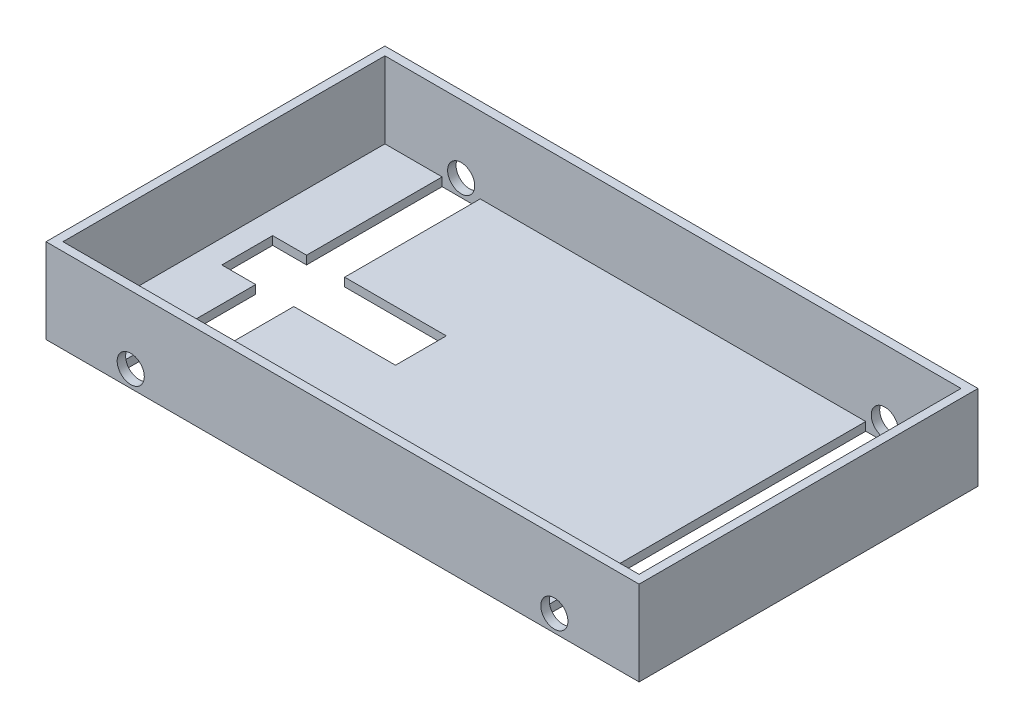
ISO-10303-21;
HEADER;
FILE_DESCRIPTION(('STEP AP214'),'2;1');
FILE_NAME('part.step','',(''),(''),'','','');
FILE_SCHEMA(('AUTOMOTIVE_DESIGN { 1 0 10303 214 1 1 1 1 }'));
ENDSEC;
DATA;
#1=APPLICATION_CONTEXT('core data for automotive mechanical design processes');
#2=APPLICATION_PROTOCOL_DEFINITION('international standard','automotive_design',2000,#1);
#3=PRODUCT_CONTEXT('',#1,'mechanical');
#4=PRODUCT('Part','Part','',(#3));
#5=PRODUCT_RELATED_PRODUCT_CATEGORY('part','',(#4));
#6=PRODUCT_DEFINITION_FORMATION('','',#4);
#7=PRODUCT_DEFINITION_CONTEXT('part definition',#1,'design');
#8=PRODUCT_DEFINITION('design','',#6,#7);
#9=PRODUCT_DEFINITION_SHAPE('','',#8);
#10=(LENGTH_UNIT() NAMED_UNIT(*) SI_UNIT(.MILLI.,.METRE.));
#11=(NAMED_UNIT(*) PLANE_ANGLE_UNIT() SI_UNIT($,.RADIAN.));
#12=(NAMED_UNIT(*) SI_UNIT($,.STERADIAN.) SOLID_ANGLE_UNIT());
#13=UNCERTAINTY_MEASURE_WITH_UNIT(LENGTH_MEASURE(1.E-05),#10,'distance_accuracy_value','');
#14=(GEOMETRIC_REPRESENTATION_CONTEXT(3) GLOBAL_UNCERTAINTY_ASSIGNED_CONTEXT((#13)) GLOBAL_UNIT_ASSIGNED_CONTEXT((#10,
#11,#12)) REPRESENTATION_CONTEXT('',''));
#15=CARTESIAN_POINT('',(0.,0.,0.));
#16=DIRECTION('',(0.,0.,1.));
#17=DIRECTION('',(1.,0.,0.));
#18=AXIS2_PLACEMENT_3D('',#15,#16,#17);
#19=CARTESIAN_POINT('',(-136.244997998398,-5.,0.));
#20=DIRECTION('',(-1.,0.,0.));
#21=DIRECTION('',(0.,0.,1.));
#22=AXIS2_PLACEMENT_3D('',#19,#20,#21);
#23=PLANE('',#22);
#24=DIRECTION('',(0.,0.,1.));
#25=VECTOR('',#24,1.);
#26=CARTESIAN_POINT('',(-136.244997998398,5.,0.));
#27=LINE('',#26,#25);
#28=CARTESIAN_POINT('',(-136.244997998398,5.,-95.));
#29=VERTEX_POINT('',#28);
#30=CARTESIAN_POINT('',(-136.244997998398,5.,-15.));
#31=VERTEX_POINT('',#30);
#32=EDGE_CURVE('E265',#29,#31,#27,.T.);
#33=ORIENTED_EDGE('',*,*,#32,.T.);
#34=DIRECTION('',(0.,-1.,0.));
#35=VECTOR('',#34,1.);
#36=CARTESIAN_POINT('',(-136.244997998398,-5.,-15.));
#37=LINE('',#36,#35);
#38=CARTESIAN_POINT('',(-136.244997998398,0.,-15.));
#39=VERTEX_POINT('',#38);
#40=EDGE_CURVE('E260',#31,#39,#37,.T.);
#41=ORIENTED_EDGE('',*,*,#40,.T.);
#42=DIRECTION('',(0.,0.,1.));
#43=VECTOR('',#42,1.);
#44=CARTESIAN_POINT('',(-136.244997998398,0.,0.));
#45=LINE('',#44,#43);
#46=CARTESIAN_POINT('',(-136.244997998398,0.,-95.));
#47=VERTEX_POINT('',#46);
#48=EDGE_CURVE('E461',#47,#39,#45,.T.);
#49=ORIENTED_EDGE('',*,*,#48,.F.);
#50=DIRECTION('',(0.,1.,0.));
#51=VECTOR('',#50,1.);
#52=CARTESIAN_POINT('',(-136.244997998398,-5.,-95.));
#53=LINE('',#52,#51);
#54=EDGE_CURVE('E275',#47,#29,#53,.T.);
#55=ORIENTED_EDGE('',*,*,#54,.T.);
#56=EDGE_LOOP('',(#33,#41,#49,#55));
#57=FACE_BOUND('',#56,.T.);
#58=ADVANCED_FACE('F46',(#57),#23,.F.);
#59=CARTESIAN_POINT('',(-113.755002001602,-5.,0.));
#60=DIRECTION('',(-1.,0.,0.));
#61=DIRECTION('',(0.,0.,1.));
#62=AXIS2_PLACEMENT_3D('',#59,#60,#61);
#63=PLANE('',#62);
#64=DIRECTION('',(0.,-1.,0.));
#65=VECTOR('',#64,1.);
#66=CARTESIAN_POINT('',(-113.755002001602,-5.,-15.));
#67=LINE('',#66,#65);
#68=CARTESIAN_POINT('',(-113.755002001602,5.,-15.));
#69=VERTEX_POINT('',#68);
#70=CARTESIAN_POINT('',(-113.755002001602,0.,-15.));
#71=VERTEX_POINT('',#70);
#72=EDGE_CURVE('E468',#69,#71,#67,.T.);
#73=ORIENTED_EDGE('',*,*,#72,.F.);
#74=DIRECTION('',(0.,0.,1.));
#75=VECTOR('',#74,1.);
#76=CARTESIAN_POINT('',(-113.755002001602,5.,0.));
#77=LINE('',#76,#75);
#78=CARTESIAN_POINT('',(-113.755002001602,5.,-95.));
#79=VERTEX_POINT('',#78);
#80=EDGE_CURVE('E270',#79,#69,#77,.T.);
#81=ORIENTED_EDGE('',*,*,#80,.F.);
#82=DIRECTION('',(0.,1.,0.));
#83=VECTOR('',#82,1.);
#84=CARTESIAN_POINT('',(-113.755002001602,-5.,-95.));
#85=LINE('',#84,#83);
#86=CARTESIAN_POINT('',(-113.755002001602,0.,-95.));
#87=VERTEX_POINT('',#86);
#88=EDGE_CURVE('E279',#87,#79,#85,.T.);
#89=ORIENTED_EDGE('',*,*,#88,.F.);
#90=DIRECTION('',(0.,0.,1.));
#91=VECTOR('',#90,1.);
#92=CARTESIAN_POINT('',(-113.755002001602,0.,0.));
#93=LINE('',#92,#91);
#94=EDGE_CURVE('E456',#87,#71,#93,.T.);
#95=ORIENTED_EDGE('',*,*,#94,.T.);
#96=EDGE_LOOP('',(#73,#81,#89,#95));
#97=FACE_BOUND('',#96,.T.);
#98=ADVANCED_FACE('F493',(#97),#63,.T.);
#99=CARTESIAN_POINT('',(0.,5.,0.));
#100=DIRECTION('',(0.,1.,0.));
#101=DIRECTION('',(0.,0.,1.));
#102=AXIS2_PLACEMENT_3D('',#99,#100,#101);
#103=PLANE('',#102);
#104=DIRECTION('',(-1.,0.,0.));
#105=VECTOR('',#104,1.);
#106=CARTESIAN_POINT('',(-156.244997998398,5.,-15.));
#107=LINE('',#106,#105);
#108=CARTESIAN_POINT('',(-53.7550020016016,5.,-15.));
#109=VERTEX_POINT('',#108);
#110=EDGE_CURVE('E215',#109,#69,#107,.T.);
#111=ORIENTED_EDGE('',*,*,#110,.F.);
#112=DIRECTION('',(0.,0.,-1.));
#113=VECTOR('',#112,1.);
#114=CARTESIAN_POINT('',(-53.7550020016016,5.,-15.));
#115=LINE('',#114,#113);
#116=CARTESIAN_POINT('',(-53.7550020016016,5.,15.));
#117=VERTEX_POINT('',#116);
#118=EDGE_CURVE('E233',#117,#109,#115,.T.);
#119=ORIENTED_EDGE('',*,*,#118,.F.);
#120=DIRECTION('',(1.,0.,0.));
#121=VECTOR('',#120,1.);
#122=CARTESIAN_POINT('',(-156.244997998398,5.,15.));
#123=LINE('',#122,#121);
#124=CARTESIAN_POINT('',(-113.755002001602,5.,15.));
#125=VERTEX_POINT('',#124);
#126=EDGE_CURVE('E226',#125,#117,#123,.T.);
#127=ORIENTED_EDGE('',*,*,#126,.F.);
#128=CARTESIAN_POINT('',(-113.755002001602,5.,95.));
#129=VERTEX_POINT('',#128);
#130=EDGE_CURVE('E269',#125,#129,#77,.T.);
#131=ORIENTED_EDGE('',*,*,#130,.T.);
#132=DIRECTION('',(-1.,0.,0.));
#133=VECTOR('',#132,1.);
#134=CARTESIAN_POINT('',(175.,5.,95.));
#135=LINE('',#134,#133);
#136=CARTESIAN_POINT('',(113.755002001602,5.,95.));
#137=VERTEX_POINT('',#136);
#138=EDGE_CURVE('E395',#137,#129,#135,.T.);
#139=ORIENTED_EDGE('',*,*,#138,.F.);
#140=DIRECTION('',(0.,0.,1.));
#141=VECTOR('',#140,1.);
#142=CARTESIAN_POINT('',(113.755002001602,5.,0.));
#143=LINE('',#142,#141);
#144=CARTESIAN_POINT('',(113.755002001602,5.,-95.));
#145=VERTEX_POINT('',#144);
#146=EDGE_CURVE('E289',#145,#137,#143,.T.);
#147=ORIENTED_EDGE('',*,*,#146,.F.);
#148=DIRECTION('',(-1.,0.,0.));
#149=VECTOR('',#148,1.);
#150=CARTESIAN_POINT('',(175.,5.,-95.));
#151=LINE('',#150,#149);
#152=EDGE_CURVE('E379',#145,#79,#151,.T.);
#153=ORIENTED_EDGE('',*,*,#152,.T.);
#154=ORIENTED_EDGE('',*,*,#80,.T.);
#155=EDGE_LOOP('',(#111,#119,#127,#131,#139,#147,#153,#154));
#156=FACE_BOUND('',#155,.T.);
#157=ADVANCED_FACE('F486',(#156),#103,.T.);
#158=CARTESIAN_POINT('',(170.,5.,-95.));
#159=VERTEX_POINT('',#158);
#160=CARTESIAN_POINT('',(136.244997998398,5.,-95.));
#161=VERTEX_POINT('',#160);
#162=EDGE_CURVE('E374',#159,#161,#151,.T.);
#163=ORIENTED_EDGE('',*,*,#162,.T.);
#164=DIRECTION('',(0.,0.,1.));
#165=VECTOR('',#164,1.);
#166=CARTESIAN_POINT('',(136.244997998398,5.,0.));
#167=LINE('',#166,#165);
#168=CARTESIAN_POINT('',(136.244997998398,5.,95.));
#169=VERTEX_POINT('',#168);
#170=EDGE_CURVE('E293',#161,#169,#167,.T.);
#171=ORIENTED_EDGE('',*,*,#170,.T.);
#172=CARTESIAN_POINT('',(170.,5.,95.));
#173=VERTEX_POINT('',#172);
#174=EDGE_CURVE('E390',#173,#169,#135,.T.);
#175=ORIENTED_EDGE('',*,*,#174,.F.);
#176=DIRECTION('',(0.,0.,-1.));
#177=VECTOR('',#176,1.);
#178=CARTESIAN_POINT('',(170.,5.,100.));
#179=LINE('',#178,#177);
#180=EDGE_CURVE('E358',#173,#159,#179,.T.);
#181=ORIENTED_EDGE('',*,*,#180,.T.);
#182=EDGE_LOOP('',(#163,#171,#175,#181));
#183=FACE_BOUND('',#182,.T.);
#184=ADVANCED_FACE('F553',(#183),#103,.T.);
#185=CARTESIAN_POINT('',(125.,10.,-122.62741699797));
#186=DIRECTION('',(0.,0.,1.));
#187=DIRECTION('',(1.,0.,0.));
#188=AXIS2_PLACEMENT_3D('',#185,#186,#187);
#189=CYLINDRICAL_SURFACE('',#188,8.);
#190=CARTESIAN_POINT('',(125.,10.,-100.));
#191=DIRECTION('',(0.,0.,1.));
#192=DIRECTION('',(1.,0.,0.));
#193=AXIS2_PLACEMENT_3D('',#190,#191,#192);
#194=CIRCLE('',#193,8.);
#195=CARTESIAN_POINT('',(133.,10.,-100.));
#196=VERTEX_POINT('',#195);
#197=EDGE_CURVE('E326',#196,#196,#194,.F.);
#198=ORIENTED_EDGE('',*,*,#197,.T.);
#199=EDGE_LOOP('',(#198));
#200=FACE_BOUND('',#199,.T.);
#201=CARTESIAN_POINT('',(125.,10.,-95.));
#202=DIRECTION('',(0.,0.,1.));
#203=DIRECTION('',(1.,0.,0.));
#204=AXIS2_PLACEMENT_3D('',#201,#202,#203);
#205=CIRCLE('',#204,8.);
#206=CARTESIAN_POINT('',(133.,10.,-95.));
#207=VERTEX_POINT('',#206);
#208=EDGE_CURVE('E346',#207,#207,#205,.T.);
#209=ORIENTED_EDGE('',*,*,#208,.T.);
#210=EDGE_LOOP('',(#209));
#211=FACE_BOUND('',#210,.T.);
#212=ADVANCED_FACE('F581',(#200,#211),#189,.F.);
#213=CARTESIAN_POINT('',(-125.,10.,-122.62741699797));
#214=DIRECTION('',(0.,0.,1.));
#215=DIRECTION('',(1.,0.,0.));
#216=AXIS2_PLACEMENT_3D('',#213,#214,#215);
#217=CYLINDRICAL_SURFACE('',#216,8.00000000000001);
#218=CARTESIAN_POINT('',(-125.,10.,-100.));
#219=DIRECTION('',(0.,0.,1.));
#220=DIRECTION('',(1.,0.,0.));
#221=AXIS2_PLACEMENT_3D('',#218,#219,#220);
#222=CIRCLE('',#221,8.00000000000001);
#223=CARTESIAN_POINT('',(-117.,10.,-100.));
#224=VERTEX_POINT('',#223);
#225=EDGE_CURVE('E331',#224,#224,#222,.F.);
#226=ORIENTED_EDGE('',*,*,#225,.T.);
#227=EDGE_LOOP('',(#226));
#228=FACE_BOUND('',#227,.T.);
#229=CARTESIAN_POINT('',(-125.,10.,-95.));
#230=DIRECTION('',(0.,0.,1.));
#231=DIRECTION('',(1.,0.,0.));
#232=AXIS2_PLACEMENT_3D('',#229,#230,#231);
#233=CIRCLE('',#232,8.00000000000001);
#234=CARTESIAN_POINT('',(-117.,10.,-95.));
#235=VERTEX_POINT('',#234);
#236=EDGE_CURVE('E354',#235,#235,#233,.T.);
#237=ORIENTED_EDGE('',*,*,#236,.T.);
#238=EDGE_LOOP('',(#237));
#239=FACE_BOUND('',#238,.T.);
#240=ADVANCED_FACE('F543',(#228,#239),#217,.F.);
#241=CARTESIAN_POINT('',(-156.244997998398,5.,-15.));
#242=VERTEX_POINT('',#241);
#243=EDGE_CURVE('E238',#31,#242,#107,.T.);
#244=ORIENTED_EDGE('',*,*,#243,.F.);
#245=ORIENTED_EDGE('',*,*,#32,.F.);
#246=CARTESIAN_POINT('',(-170.,5.,-95.));
#247=VERTEX_POINT('',#246);
#248=EDGE_CURVE('E362',#29,#247,#151,.T.);
#249=ORIENTED_EDGE('',*,*,#248,.T.);
#250=DIRECTION('',(0.,0.,-1.));
#251=VECTOR('',#250,1.);
#252=CARTESIAN_POINT('',(-170.,5.,100.));
#253=LINE('',#252,#251);
#254=CARTESIAN_POINT('',(-170.,5.,95.));
#255=VERTEX_POINT('',#254);
#256=EDGE_CURVE('E378',#255,#247,#253,.T.);
#257=ORIENTED_EDGE('',*,*,#256,.F.);
#258=CARTESIAN_POINT('',(-136.244997998398,5.,95.));
#259=VERTEX_POINT('',#258);
#260=EDGE_CURVE('E386',#259,#255,#135,.T.);
#261=ORIENTED_EDGE('',*,*,#260,.F.);
#262=CARTESIAN_POINT('',(-136.244997998398,5.,15.));
#263=VERTEX_POINT('',#262);
#264=EDGE_CURVE('E231',#263,#259,#27,.T.);
#265=ORIENTED_EDGE('',*,*,#264,.F.);
#266=CARTESIAN_POINT('',(-156.244997998398,5.,15.));
#267=VERTEX_POINT('',#266);
#268=EDGE_CURVE('E62',#267,#263,#123,.T.);
#269=ORIENTED_EDGE('',*,*,#268,.F.);
#270=DIRECTION('',(0.,0.,1.));
#271=VECTOR('',#270,1.);
#272=CARTESIAN_POINT('',(-156.244997998398,5.,-15.));
#273=LINE('',#272,#271);
#274=EDGE_CURVE('E218',#242,#267,#273,.T.);
#275=ORIENTED_EDGE('',*,*,#274,.F.);
#276=EDGE_LOOP('',(#244,#245,#249,#257,#261,#265,#269,#275));
#277=FACE_BOUND('',#276,.T.);
#278=ADVANCED_FACE('F229',(#277),#103,.T.);
#279=CARTESIAN_POINT('',(175.,50.,100.));
#280=DIRECTION('',(-1.,0.,0.));
#281=DIRECTION('',(0.,0.,1.));
#282=AXIS2_PLACEMENT_3D('',#279,#280,#281);
#283=PLANE('',#282);
#284=DIRECTION('',(0.,0.,-1.));
#285=VECTOR('',#284,1.);
#286=CARTESIAN_POINT('',(175.,0.,100.));
#287=LINE('',#286,#285);
#288=CARTESIAN_POINT('',(175.,0.,100.));
#289=VERTEX_POINT('',#288);
#290=CARTESIAN_POINT('',(175.,0.,-100.));
#291=VERTEX_POINT('',#290);
#292=EDGE_CURVE('E367',#289,#291,#287,.T.);
#293=ORIENTED_EDGE('',*,*,#292,.T.);
#294=DIRECTION('',(0.,-1.,0.));
#295=VECTOR('',#294,1.);
#296=CARTESIAN_POINT('',(175.,50.,-100.));
#297=LINE('',#296,#295);
#298=CARTESIAN_POINT('',(175.,50.,-100.));
#299=VERTEX_POINT('',#298);
#300=EDGE_CURVE('E447',#299,#291,#297,.T.);
#301=ORIENTED_EDGE('',*,*,#300,.F.);
#302=DIRECTION('',(0.,0.,-1.));
#303=VECTOR('',#302,1.);
#304=CARTESIAN_POINT('',(175.,50.,100.));
#305=LINE('',#304,#303);
#306=CARTESIAN_POINT('',(175.,50.,100.));
#307=VERTEX_POINT('',#306);
#308=EDGE_CURVE('E408',#307,#299,#305,.T.);
#309=ORIENTED_EDGE('',*,*,#308,.F.);
#310=DIRECTION('',(0.,-1.,0.));
#311=VECTOR('',#310,1.);
#312=CARTESIAN_POINT('',(175.,50.,100.));
#313=LINE('',#312,#311);
#314=EDGE_CURVE('E424',#307,#289,#313,.T.);
#315=ORIENTED_EDGE('',*,*,#314,.T.);
#316=EDGE_LOOP('',(#293,#301,#309,#315));
#317=FACE_BOUND('',#316,.T.);
#318=ADVANCED_FACE('F48',(#317),#283,.F.);
#319=CARTESIAN_POINT('',(175.,50.,-100.));
#320=DIRECTION('',(0.,0.,1.));
#321=DIRECTION('',(1.,0.,0.));
#322=AXIS2_PLACEMENT_3D('',#319,#320,#321);
#323=PLANE('',#322);
#324=ORIENTED_EDGE('',*,*,#225,.F.);
#325=EDGE_LOOP('',(#324));
#326=FACE_BOUND('',#325,.T.);
#327=ORIENTED_EDGE('',*,*,#197,.F.);
#328=EDGE_LOOP('',(#327));
#329=FACE_BOUND('',#328,.T.);
#330=DIRECTION('',(-1.,0.,0.));
#331=VECTOR('',#330,1.);
#332=CARTESIAN_POINT('',(175.,0.,-100.));
#333=LINE('',#332,#331);
#334=CARTESIAN_POINT('',(-175.,0.,-100.));
#335=VERTEX_POINT('',#334);
#336=EDGE_CURVE('E428',#291,#335,#333,.T.);
#337=ORIENTED_EDGE('',*,*,#336,.T.);
#338=DIRECTION('',(0.,-1.,0.));
#339=VECTOR('',#338,1.);
#340=CARTESIAN_POINT('',(-175.,50.,-100.));
#341=LINE('',#340,#339);
#342=CARTESIAN_POINT('',(-175.,50.,-100.));
#343=VERTEX_POINT('',#342);
#344=EDGE_CURVE('E444',#343,#335,#341,.T.);
#345=ORIENTED_EDGE('',*,*,#344,.F.);
#346=DIRECTION('',(-1.,0.,0.));
#347=VECTOR('',#346,1.);
#348=CARTESIAN_POINT('',(175.,50.,-100.));
#349=LINE('',#348,#347);
#350=EDGE_CURVE('E412',#299,#343,#349,.T.);
#351=ORIENTED_EDGE('',*,*,#350,.F.);
#352=ORIENTED_EDGE('',*,*,#300,.T.);
#353=EDGE_LOOP('',(#337,#345,#351,#352));
#354=FACE_BOUND('',#353,.T.);
#355=ADVANCED_FACE('F605',(#326,#329,#354),#323,.F.);
#356=CARTESIAN_POINT('',(-175.,50.,100.));
#357=DIRECTION('',(-1.,0.,0.));
#358=DIRECTION('',(0.,0.,1.));
#359=AXIS2_PLACEMENT_3D('',#356,#357,#358);
#360=PLANE('',#359);
#361=DIRECTION('',(0.,0.,-1.));
#362=VECTOR('',#361,1.);
#363=CARTESIAN_POINT('',(-175.,0.,100.));
#364=LINE('',#363,#362);
#365=CARTESIAN_POINT('',(-175.,0.,100.));
#366=VERTEX_POINT('',#365);
#367=EDGE_CURVE('E432',#366,#335,#364,.T.);
#368=ORIENTED_EDGE('',*,*,#367,.F.);
#369=DIRECTION('',(0.,-1.,0.));
#370=VECTOR('',#369,1.);
#371=CARTESIAN_POINT('',(-175.,50.,100.));
#372=LINE('',#371,#370);
#373=CARTESIAN_POINT('',(-175.,50.,100.));
#374=VERTEX_POINT('',#373);
#375=EDGE_CURVE('E441',#374,#366,#372,.T.);
#376=ORIENTED_EDGE('',*,*,#375,.F.);
#377=DIRECTION('',(0.,0.,-1.));
#378=VECTOR('',#377,1.);
#379=CARTESIAN_POINT('',(-175.,50.,100.));
#380=LINE('',#379,#378);
#381=EDGE_CURVE('E416',#374,#343,#380,.T.);
#382=ORIENTED_EDGE('',*,*,#381,.T.);
#383=ORIENTED_EDGE('',*,*,#344,.T.);
#384=EDGE_LOOP('',(#368,#376,#382,#383));
#385=FACE_BOUND('',#384,.T.);
#386=ADVANCED_FACE('F602',(#385),#360,.T.);
#387=CARTESIAN_POINT('',(175.,50.,100.));
#388=DIRECTION('',(0.,0.,1.));
#389=DIRECTION('',(1.,0.,0.));
#390=AXIS2_PLACEMENT_3D('',#387,#388,#389);
#391=PLANE('',#390);
#392=CARTESIAN_POINT('',(-125.,10.,100.));
#393=DIRECTION('',(0.,0.,1.));
#394=DIRECTION('',(1.,0.,0.));
#395=AXIS2_PLACEMENT_3D('',#392,#393,#394);
#396=CIRCLE('',#395,8.00000000000001);
#397=CARTESIAN_POINT('',(-117.,10.,100.));
#398=VERTEX_POINT('',#397);
#399=EDGE_CURVE('E327',#398,#398,#396,.T.);
#400=ORIENTED_EDGE('',*,*,#399,.F.);
#401=EDGE_LOOP('',(#400));
#402=FACE_BOUND('',#401,.T.);
#403=CARTESIAN_POINT('',(125.,10.,100.));
#404=DIRECTION('',(0.,0.,1.));
#405=DIRECTION('',(-1.,0.,0.));
#406=AXIS2_PLACEMENT_3D('',#403,#404,#405);
#407=CIRCLE('',#406,8.);
#408=CARTESIAN_POINT('',(117.,10.,100.));
#409=VERTEX_POINT('',#408);
#410=EDGE_CURVE('E332',#409,#409,#407,.T.);
#411=ORIENTED_EDGE('',*,*,#410,.F.);
#412=EDGE_LOOP('',(#411));
#413=FACE_BOUND('',#412,.T.);
#414=DIRECTION('',(-1.,0.,0.));
#415=VECTOR('',#414,1.);
#416=CARTESIAN_POINT('',(175.,0.,100.));
#417=LINE('',#416,#415);
#418=EDGE_CURVE('E413',#289,#366,#417,.T.);
#419=ORIENTED_EDGE('',*,*,#418,.F.);
#420=ORIENTED_EDGE('',*,*,#314,.F.);
#421=DIRECTION('',(-1.,0.,0.));
#422=VECTOR('',#421,1.);
#423=CARTESIAN_POINT('',(175.,50.,100.));
#424=LINE('',#423,#422);
#425=EDGE_CURVE('E420',#307,#374,#424,.T.);
#426=ORIENTED_EDGE('',*,*,#425,.T.);
#427=ORIENTED_EDGE('',*,*,#375,.T.);
#428=EDGE_LOOP('',(#419,#420,#426,#427));
#429=FACE_BOUND('',#428,.T.);
#430=ADVANCED_FACE('F597',(#402,#413,#429),#391,.T.);
#431=CARTESIAN_POINT('',(0.,50.,0.));
#432=DIRECTION('',(0.,1.,0.));
#433=DIRECTION('',(0.,0.,1.));
#434=AXIS2_PLACEMENT_3D('',#431,#432,#433);
#435=PLANE('',#434);
#436=DIRECTION('',(0.,0.,-1.));
#437=VECTOR('',#436,1.);
#438=CARTESIAN_POINT('',(170.,50.,100.));
#439=LINE('',#438,#437);
#440=CARTESIAN_POINT('',(170.,50.,95.));
#441=VERTEX_POINT('',#440);
#442=CARTESIAN_POINT('',(170.,50.,-95.));
#443=VERTEX_POINT('',#442);
#444=EDGE_CURVE('E394',#441,#443,#439,.T.);
#445=ORIENTED_EDGE('',*,*,#444,.F.);
#446=DIRECTION('',(-1.,0.,0.));
#447=VECTOR('',#446,1.);
#448=CARTESIAN_POINT('',(175.,50.,95.));
#449=LINE('',#448,#447);
#450=CARTESIAN_POINT('',(-170.,50.,95.));
#451=VERTEX_POINT('',#450);
#452=EDGE_CURVE('E373',#441,#451,#449,.T.);
#453=ORIENTED_EDGE('',*,*,#452,.T.);
#454=DIRECTION('',(0.,0.,-1.));
#455=VECTOR('',#454,1.);
#456=CARTESIAN_POINT('',(-170.,50.,100.));
#457=LINE('',#456,#455);
#458=CARTESIAN_POINT('',(-170.,50.,-95.));
#459=VERTEX_POINT('',#458);
#460=EDGE_CURVE('E401',#451,#459,#457,.T.);
#461=ORIENTED_EDGE('',*,*,#460,.T.);
#462=DIRECTION('',(-1.,0.,0.));
#463=VECTOR('',#462,1.);
#464=CARTESIAN_POINT('',(175.,50.,-95.));
#465=LINE('',#464,#463);
#466=EDGE_CURVE('E398',#443,#459,#465,.T.);
#467=ORIENTED_EDGE('',*,*,#466,.F.);
#468=EDGE_LOOP('',(#445,#453,#461,#467));
#469=FACE_BOUND('',#468,.T.);
#470=ORIENTED_EDGE('',*,*,#308,.T.);
#471=ORIENTED_EDGE('',*,*,#350,.T.);
#472=ORIENTED_EDGE('',*,*,#381,.F.);
#473=ORIENTED_EDGE('',*,*,#425,.F.);
#474=EDGE_LOOP('',(#470,#471,#472,#473));
#475=FACE_BOUND('',#474,.T.);
#476=ADVANCED_FACE('F594',(#469,#475),#435,.T.);
#477=CARTESIAN_POINT('',(0.,0.,0.));
#478=DIRECTION('',(0.,1.,0.));
#479=DIRECTION('',(0.,0.,1.));
#480=AXIS2_PLACEMENT_3D('',#477,#478,#479);
#481=PLANE('',#480);
#482=ORIENTED_EDGE('',*,*,#48,.T.);
#483=DIRECTION('',(-1.,0.,0.));
#484=VECTOR('',#483,1.);
#485=CARTESIAN_POINT('',(0.,0.,-15.));
#486=LINE('',#485,#484);
#487=CARTESIAN_POINT('',(-156.244997998398,0.,-15.));
#488=VERTEX_POINT('',#487);
#489=EDGE_CURVE('E261',#39,#488,#486,.T.);
#490=ORIENTED_EDGE('',*,*,#489,.T.);
#491=DIRECTION('',(0.,0.,1.));
#492=VECTOR('',#491,1.);
#493=CARTESIAN_POINT('',(-156.244997998398,0.,0.));
#494=LINE('',#493,#492);
#495=CARTESIAN_POINT('',(-156.244997998398,0.,15.));
#496=VERTEX_POINT('',#495);
#497=EDGE_CURVE('E12',#488,#496,#494,.T.);
#498=ORIENTED_EDGE('',*,*,#497,.T.);
#499=DIRECTION('',(1.,0.,0.));
#500=VECTOR('',#499,1.);
#501=CARTESIAN_POINT('',(0.,0.,15.));
#502=LINE('',#501,#500);
#503=CARTESIAN_POINT('',(-136.244997998398,0.,15.));
#504=VERTEX_POINT('',#503);
#505=EDGE_CURVE('E211',#496,#504,#502,.T.);
#506=ORIENTED_EDGE('',*,*,#505,.T.);
#507=CARTESIAN_POINT('',(-136.244997998398,0.,95.));
#508=VERTEX_POINT('',#507);
#509=EDGE_CURVE('E460',#504,#508,#45,.T.);
#510=ORIENTED_EDGE('',*,*,#509,.T.);
#511=DIRECTION('',(1.,0.,0.));
#512=VECTOR('',#511,1.);
#513=CARTESIAN_POINT('',(0.,0.,95.));
#514=LINE('',#513,#512);
#515=CARTESIAN_POINT('',(-113.755002001602,0.,95.));
#516=VERTEX_POINT('',#515);
#517=EDGE_CURVE('E278',#508,#516,#514,.T.);
#518=ORIENTED_EDGE('',*,*,#517,.T.);
#519=CARTESIAN_POINT('',(-113.755002001602,0.,15.));
#520=VERTEX_POINT('',#519);
#521=EDGE_CURVE('E455',#520,#516,#93,.T.);
#522=ORIENTED_EDGE('',*,*,#521,.F.);
#523=CARTESIAN_POINT('',(-53.7550020016016,0.,15.));
#524=VERTEX_POINT('',#523);
#525=EDGE_CURVE('E70',#520,#524,#502,.T.);
#526=ORIENTED_EDGE('',*,*,#525,.T.);
#527=DIRECTION('',(0.,0.,-1.));
#528=VECTOR('',#527,1.);
#529=CARTESIAN_POINT('',(-53.7550020016016,0.,0.));
#530=LINE('',#529,#528);
#531=CARTESIAN_POINT('',(-53.7550020016016,0.,-15.));
#532=VERTEX_POINT('',#531);
#533=EDGE_CURVE('E55',#524,#532,#530,.T.);
#534=ORIENTED_EDGE('',*,*,#533,.T.);
#535=EDGE_CURVE('E256',#532,#71,#486,.T.);
#536=ORIENTED_EDGE('',*,*,#535,.T.);
#537=ORIENTED_EDGE('',*,*,#94,.F.);
#538=DIRECTION('',(1.,0.,0.));
#539=VECTOR('',#538,1.);
#540=CARTESIAN_POINT('',(0.,0.,-95.));
#541=LINE('',#540,#539);
#542=EDGE_CURVE('E312',#47,#87,#541,.T.);
#543=ORIENTED_EDGE('',*,*,#542,.F.);
#544=EDGE_LOOP('',(#482,#490,#498,#506,#510,#518,#522,#526,#534,#536,#537,#543));
#545=FACE_BOUND('',#544,.T.);
#546=DIRECTION('',(0.,0.,1.));
#547=VECTOR('',#546,1.);
#548=CARTESIAN_POINT('',(136.244997998398,0.,0.));
#549=LINE('',#548,#547);
#550=CARTESIAN_POINT('',(136.244997998398,0.,-95.));
#551=VERTEX_POINT('',#550);
#552=CARTESIAN_POINT('',(136.244997998398,0.,95.));
#553=VERTEX_POINT('',#552);
#554=EDGE_CURVE('E323',#551,#553,#549,.T.);
#555=ORIENTED_EDGE('',*,*,#554,.F.);
#556=DIRECTION('',(-1.,0.,0.));
#557=VECTOR('',#556,1.);
#558=CARTESIAN_POINT('',(0.,0.,-95.));
#559=LINE('',#558,#557);
#560=CARTESIAN_POINT('',(113.755002001602,0.,-95.));
#561=VERTEX_POINT('',#560);
#562=EDGE_CURVE('E319',#551,#561,#559,.T.);
#563=ORIENTED_EDGE('',*,*,#562,.T.);
#564=DIRECTION('',(0.,0.,1.));
#565=VECTOR('',#564,1.);
#566=CARTESIAN_POINT('',(113.755002001602,0.,0.));
#567=LINE('',#566,#565);
#568=CARTESIAN_POINT('',(113.755002001602,0.,95.));
#569=VERTEX_POINT('',#568);
#570=EDGE_CURVE('E451',#561,#569,#567,.T.);
#571=ORIENTED_EDGE('',*,*,#570,.T.);
#572=DIRECTION('',(1.,0.,0.));
#573=VECTOR('',#572,1.);
#574=CARTESIAN_POINT('',(0.,0.,95.));
#575=LINE('',#574,#573);
#576=EDGE_CURVE('E315',#569,#553,#575,.T.);
#577=ORIENTED_EDGE('',*,*,#576,.T.);
#578=EDGE_LOOP('',(#555,#563,#571,#577));
#579=FACE_BOUND('',#578,.T.);
#580=ORIENTED_EDGE('',*,*,#292,.F.);
#581=ORIENTED_EDGE('',*,*,#418,.T.);
#582=ORIENTED_EDGE('',*,*,#367,.T.);
#583=ORIENTED_EDGE('',*,*,#336,.F.);
#584=EDGE_LOOP('',(#580,#581,#582,#583));
#585=FACE_BOUND('',#584,.T.);
#586=ADVANCED_FACE('F473',(#545,#579,#585),#481,.F.);
#587=CARTESIAN_POINT('',(170.,50.,100.));
#588=DIRECTION('',(-1.,0.,0.));
#589=DIRECTION('',(0.,0.,1.));
#590=AXIS2_PLACEMENT_3D('',#587,#588,#589);
#591=PLANE('',#590);
#592=ORIENTED_EDGE('',*,*,#180,.F.);
#593=DIRECTION('',(0.,-1.,0.));
#594=VECTOR('',#593,1.);
#595=CARTESIAN_POINT('',(170.,50.,95.));
#596=LINE('',#595,#594);
#597=EDGE_CURVE('E369',#441,#173,#596,.T.);
#598=ORIENTED_EDGE('',*,*,#597,.F.);
#599=ORIENTED_EDGE('',*,*,#444,.T.);
#600=DIRECTION('',(0.,-1.,0.));
#601=VECTOR('',#600,1.);
#602=CARTESIAN_POINT('',(170.,50.,-95.));
#603=LINE('',#602,#601);
#604=EDGE_CURVE('E363',#443,#159,#603,.T.);
#605=ORIENTED_EDGE('',*,*,#604,.T.);
#606=EDGE_LOOP('',(#592,#598,#599,#605));
#607=FACE_BOUND('',#606,.T.);
#608=ADVANCED_FACE('F582',(#607),#591,.T.);
#609=CARTESIAN_POINT('',(175.,50.,-95.));
#610=DIRECTION('',(0.,0.,1.));
#611=DIRECTION('',(1.,0.,0.));
#612=AXIS2_PLACEMENT_3D('',#609,#610,#611);
#613=PLANE('',#612);
#614=ORIENTED_EDGE('',*,*,#88,.T.);
#615=ORIENTED_EDGE('',*,*,#152,.F.);
#616=DIRECTION('',(0.,1.,0.));
#617=VECTOR('',#616,1.);
#618=CARTESIAN_POINT('',(113.755002001602,-5.,-95.));
#619=LINE('',#618,#617);
#620=EDGE_CURVE('E297',#561,#145,#619,.T.);
#621=ORIENTED_EDGE('',*,*,#620,.F.);
#622=ORIENTED_EDGE('',*,*,#562,.F.);
#623=DIRECTION('',(0.,1.,0.));
#624=VECTOR('',#623,1.);
#625=CARTESIAN_POINT('',(136.244997998398,-5.,-95.));
#626=LINE('',#625,#624);
#627=EDGE_CURVE('E298',#551,#161,#626,.T.);
#628=ORIENTED_EDGE('',*,*,#627,.T.);
#629=ORIENTED_EDGE('',*,*,#162,.F.);
#630=ORIENTED_EDGE('',*,*,#604,.F.);
#631=ORIENTED_EDGE('',*,*,#466,.T.);
#632=DIRECTION('',(0.,-1.,0.));
#633=VECTOR('',#632,1.);
#634=CARTESIAN_POINT('',(-170.,50.,-95.));
#635=LINE('',#634,#633);
#636=EDGE_CURVE('E368',#459,#247,#635,.T.);
#637=ORIENTED_EDGE('',*,*,#636,.T.);
#638=ORIENTED_EDGE('',*,*,#248,.F.);
#639=ORIENTED_EDGE('',*,*,#54,.F.);
#640=ORIENTED_EDGE('',*,*,#542,.T.);
#641=EDGE_LOOP('',(#614,#615,#621,#622,#628,#629,#630,#631,#637,#638,#639,#640));
#642=FACE_BOUND('',#641,.T.);
#643=ORIENTED_EDGE('',*,*,#236,.F.);
#644=EDGE_LOOP('',(#643));
#645=FACE_BOUND('',#644,.T.);
#646=ORIENTED_EDGE('',*,*,#208,.F.);
#647=EDGE_LOOP('',(#646));
#648=FACE_BOUND('',#647,.T.);
#649=ADVANCED_FACE('F499',(#642,#645,#648),#613,.T.);
#650=CARTESIAN_POINT('',(-170.,50.,100.));
#651=DIRECTION('',(-1.,0.,0.));
#652=DIRECTION('',(0.,0.,1.));
#653=AXIS2_PLACEMENT_3D('',#650,#651,#652);
#654=PLANE('',#653);
#655=ORIENTED_EDGE('',*,*,#256,.T.);
#656=ORIENTED_EDGE('',*,*,#636,.F.);
#657=ORIENTED_EDGE('',*,*,#460,.F.);
#658=DIRECTION('',(0.,-1.,0.));
#659=VECTOR('',#658,1.);
#660=CARTESIAN_POINT('',(-170.,50.,95.));
#661=LINE('',#660,#659);
#662=EDGE_CURVE('E372',#451,#255,#661,.T.);
#663=ORIENTED_EDGE('',*,*,#662,.T.);
#664=EDGE_LOOP('',(#655,#656,#657,#663));
#665=FACE_BOUND('',#664,.T.);
#666=ADVANCED_FACE('F588',(#665),#654,.F.);
#667=CARTESIAN_POINT('',(175.,50.,95.));
#668=DIRECTION('',(0.,0.,1.));
#669=DIRECTION('',(1.,0.,0.));
#670=AXIS2_PLACEMENT_3D('',#667,#668,#669);
#671=PLANE('',#670);
#672=ORIENTED_EDGE('',*,*,#138,.T.);
#673=DIRECTION('',(0.,1.,0.));
#674=VECTOR('',#673,1.);
#675=CARTESIAN_POINT('',(-113.755002001602,-5.,95.));
#676=LINE('',#675,#674);
#677=EDGE_CURVE('E282',#516,#129,#676,.T.);
#678=ORIENTED_EDGE('',*,*,#677,.F.);
#679=ORIENTED_EDGE('',*,*,#517,.F.);
#680=DIRECTION('',(0.,1.,0.));
#681=VECTOR('',#680,1.);
#682=CARTESIAN_POINT('',(-136.244997998398,-5.,95.));
#683=LINE('',#682,#681);
#684=EDGE_CURVE('E274',#508,#259,#683,.T.);
#685=ORIENTED_EDGE('',*,*,#684,.T.);
#686=ORIENTED_EDGE('',*,*,#260,.T.);
#687=ORIENTED_EDGE('',*,*,#662,.F.);
#688=ORIENTED_EDGE('',*,*,#452,.F.);
#689=ORIENTED_EDGE('',*,*,#597,.T.);
#690=ORIENTED_EDGE('',*,*,#174,.T.);
#691=DIRECTION('',(0.,1.,0.));
#692=VECTOR('',#691,1.);
#693=CARTESIAN_POINT('',(136.244997998398,-5.,95.));
#694=LINE('',#693,#692);
#695=EDGE_CURVE('E301',#553,#169,#694,.T.);
#696=ORIENTED_EDGE('',*,*,#695,.F.);
#697=ORIENTED_EDGE('',*,*,#576,.F.);
#698=DIRECTION('',(0.,1.,0.));
#699=VECTOR('',#698,1.);
#700=CARTESIAN_POINT('',(113.755002001602,-5.,95.));
#701=LINE('',#700,#699);
#702=EDGE_CURVE('E304',#569,#137,#701,.T.);
#703=ORIENTED_EDGE('',*,*,#702,.T.);
#704=EDGE_LOOP('',(#672,#678,#679,#685,#686,#687,#688,#689,#690,#696,#697,#703));
#705=FACE_BOUND('',#704,.T.);
#706=CARTESIAN_POINT('',(-125.,10.,95.));
#707=DIRECTION('',(0.,0.,1.));
#708=DIRECTION('',(1.,0.,0.));
#709=AXIS2_PLACEMENT_3D('',#706,#707,#708);
#710=CIRCLE('',#709,8.00000000000001);
#711=CARTESIAN_POINT('',(-117.,10.,95.));
#712=VERTEX_POINT('',#711);
#713=EDGE_CURVE('E350',#712,#712,#710,.T.);
#714=ORIENTED_EDGE('',*,*,#713,.T.);
#715=EDGE_LOOP('',(#714));
#716=FACE_BOUND('',#715,.T.);
#717=CARTESIAN_POINT('',(125.,10.,95.));
#718=DIRECTION('',(0.,0.,1.));
#719=DIRECTION('',(1.,0.,0.));
#720=AXIS2_PLACEMENT_3D('',#717,#718,#719);
#721=CIRCLE('',#720,8.);
#722=CARTESIAN_POINT('',(133.,10.,95.));
#723=VERTEX_POINT('',#722);
#724=EDGE_CURVE('E336',#723,#723,#721,.T.);
#725=ORIENTED_EDGE('',*,*,#724,.T.);
#726=EDGE_LOOP('',(#725));
#727=FACE_BOUND('',#726,.T.);
#728=ADVANCED_FACE('F525',(#705,#716,#727),#671,.F.);
#729=ORIENTED_EDGE('',*,*,#724,.F.);
#730=EDGE_LOOP('',(#729));
#731=FACE_BOUND('',#730,.T.);
#732=ORIENTED_EDGE('',*,*,#410,.T.);
#733=EDGE_LOOP('',(#732));
#734=FACE_BOUND('',#733,.T.);
#735=ADVANCED_FACE('F540',(#731,#734),#189,.F.);
#736=ORIENTED_EDGE('',*,*,#713,.F.);
#737=EDGE_LOOP('',(#736));
#738=FACE_BOUND('',#737,.T.);
#739=ORIENTED_EDGE('',*,*,#399,.T.);
#740=EDGE_LOOP('',(#739));
#741=FACE_BOUND('',#740,.T.);
#742=ADVANCED_FACE('F530',(#738,#741),#217,.F.);
#743=ORIENTED_EDGE('',*,*,#509,.F.);
#744=DIRECTION('',(0.,1.,0.));
#745=VECTOR('',#744,1.);
#746=CARTESIAN_POINT('',(-136.244997998398,-5.,15.));
#747=LINE('',#746,#745);
#748=EDGE_CURVE('E253',#504,#263,#747,.T.);
#749=ORIENTED_EDGE('',*,*,#748,.T.);
#750=ORIENTED_EDGE('',*,*,#264,.T.);
#751=ORIENTED_EDGE('',*,*,#684,.F.);
#752=EDGE_LOOP('',(#743,#749,#750,#751));
#753=FACE_BOUND('',#752,.T.);
#754=ADVANCED_FACE('F527',(#753),#23,.F.);
#755=DIRECTION('',(0.,1.,0.));
#756=VECTOR('',#755,1.);
#757=CARTESIAN_POINT('',(-113.755002001602,-5.,15.));
#758=LINE('',#757,#756);
#759=EDGE_CURVE('E465',#520,#125,#758,.T.);
#760=ORIENTED_EDGE('',*,*,#759,.F.);
#761=ORIENTED_EDGE('',*,*,#521,.T.);
#762=ORIENTED_EDGE('',*,*,#677,.T.);
#763=ORIENTED_EDGE('',*,*,#130,.F.);
#764=EDGE_LOOP('',(#760,#761,#762,#763));
#765=FACE_BOUND('',#764,.T.);
#766=ADVANCED_FACE('F529',(#765),#63,.T.);
#767=CARTESIAN_POINT('',(113.755002001602,-5.,0.));
#768=DIRECTION('',(-1.,0.,0.));
#769=DIRECTION('',(0.,0.,1.));
#770=AXIS2_PLACEMENT_3D('',#767,#768,#769);
#771=PLANE('',#770);
#772=ORIENTED_EDGE('',*,*,#620,.T.);
#773=ORIENTED_EDGE('',*,*,#146,.T.);
#774=ORIENTED_EDGE('',*,*,#702,.F.);
#775=ORIENTED_EDGE('',*,*,#570,.F.);
#776=EDGE_LOOP('',(#772,#773,#774,#775));
#777=FACE_BOUND('',#776,.T.);
#778=ADVANCED_FACE('F536',(#777),#771,.F.);
#779=CARTESIAN_POINT('',(136.244997998398,-5.,0.));
#780=DIRECTION('',(-1.,0.,0.));
#781=DIRECTION('',(0.,0.,1.));
#782=AXIS2_PLACEMENT_3D('',#779,#780,#781);
#783=PLANE('',#782);
#784=ORIENTED_EDGE('',*,*,#554,.T.);
#785=ORIENTED_EDGE('',*,*,#695,.T.);
#786=ORIENTED_EDGE('',*,*,#170,.F.);
#787=ORIENTED_EDGE('',*,*,#627,.F.);
#788=EDGE_LOOP('',(#784,#785,#786,#787));
#789=FACE_BOUND('',#788,.T.);
#790=ADVANCED_FACE('F567',(#789),#783,.T.);
#791=CARTESIAN_POINT('',(-156.244997998398,-5.,-15.));
#792=DIRECTION('',(0.,0.,-1.));
#793=DIRECTION('',(-1.,0.,0.));
#794=AXIS2_PLACEMENT_3D('',#791,#792,#793);
#795=PLANE('',#794);
#796=DIRECTION('',(0.,1.,0.));
#797=VECTOR('',#796,1.);
#798=CARTESIAN_POINT('',(-53.7550020016016,-5.,-15.));
#799=LINE('',#798,#797);
#800=EDGE_CURVE('E246',#532,#109,#799,.T.);
#801=ORIENTED_EDGE('',*,*,#800,.T.);
#802=ORIENTED_EDGE('',*,*,#110,.T.);
#803=ORIENTED_EDGE('',*,*,#72,.T.);
#804=ORIENTED_EDGE('',*,*,#535,.F.);
#805=EDGE_LOOP('',(#801,#802,#803,#804));
#806=FACE_BOUND('',#805,.T.);
#807=ADVANCED_FACE('F491',(#806),#795,.F.);
#808=CARTESIAN_POINT('',(-156.244997998398,-5.,15.));
#809=DIRECTION('',(0.,0.,1.));
#810=DIRECTION('',(1.,0.,0.));
#811=AXIS2_PLACEMENT_3D('',#808,#809,#810);
#812=PLANE('',#811);
#813=ORIENTED_EDGE('',*,*,#759,.T.);
#814=ORIENTED_EDGE('',*,*,#126,.T.);
#815=DIRECTION('',(0.,1.,0.));
#816=VECTOR('',#815,1.);
#817=CARTESIAN_POINT('',(-53.7550020016016,-5.,15.));
#818=LINE('',#817,#816);
#819=EDGE_CURVE('E214',#524,#117,#818,.T.);
#820=ORIENTED_EDGE('',*,*,#819,.F.);
#821=ORIENTED_EDGE('',*,*,#525,.F.);
#822=EDGE_LOOP('',(#813,#814,#820,#821));
#823=FACE_BOUND('',#822,.T.);
#824=ADVANCED_FACE('F480',(#823),#812,.F.);
#825=CARTESIAN_POINT('',(-53.7550020016016,-5.,-15.));
#826=DIRECTION('',(1.,0.,0.));
#827=DIRECTION('',(0.,0.,-1.));
#828=AXIS2_PLACEMENT_3D('',#825,#826,#827);
#829=PLANE('',#828);
#830=ORIENTED_EDGE('',*,*,#819,.T.);
#831=ORIENTED_EDGE('',*,*,#118,.T.);
#832=ORIENTED_EDGE('',*,*,#800,.F.);
#833=ORIENTED_EDGE('',*,*,#533,.F.);
#834=EDGE_LOOP('',(#830,#831,#832,#833));
#835=FACE_BOUND('',#834,.T.);
#836=ADVANCED_FACE('F479',(#835),#829,.F.);
#837=CARTESIAN_POINT('',(-156.244997998398,-5.,-15.));
#838=DIRECTION('',(-1.,0.,0.));
#839=DIRECTION('',(0.,0.,1.));
#840=AXIS2_PLACEMENT_3D('',#837,#838,#839);
#841=PLANE('',#840);
#842=DIRECTION('',(0.,1.,0.));
#843=VECTOR('',#842,1.);
#844=CARTESIAN_POINT('',(-156.244997998398,-5.,-15.));
#845=LINE('',#844,#843);
#846=EDGE_CURVE('E221',#488,#242,#845,.T.);
#847=ORIENTED_EDGE('',*,*,#846,.T.);
#848=ORIENTED_EDGE('',*,*,#274,.T.);
#849=DIRECTION('',(0.,1.,0.));
#850=VECTOR('',#849,1.);
#851=CARTESIAN_POINT('',(-156.244997998398,-5.,15.));
#852=LINE('',#851,#850);
#853=EDGE_CURVE('E207',#496,#267,#852,.T.);
#854=ORIENTED_EDGE('',*,*,#853,.F.);
#855=ORIENTED_EDGE('',*,*,#497,.F.);
#856=EDGE_LOOP('',(#847,#848,#854,#855));
#857=FACE_BOUND('',#856,.T.);
#858=ADVANCED_FACE('F219',(#857),#841,.F.);
#859=ORIENTED_EDGE('',*,*,#40,.F.);
#860=ORIENTED_EDGE('',*,*,#243,.T.);
#861=ORIENTED_EDGE('',*,*,#846,.F.);
#862=ORIENTED_EDGE('',*,*,#489,.F.);
#863=EDGE_LOOP('',(#859,#860,#861,#862));
#864=FACE_BOUND('',#863,.T.);
#865=ADVANCED_FACE('F558',(#864),#795,.F.);
#866=ORIENTED_EDGE('',*,*,#853,.T.);
#867=ORIENTED_EDGE('',*,*,#268,.T.);
#868=ORIENTED_EDGE('',*,*,#748,.F.);
#869=ORIENTED_EDGE('',*,*,#505,.F.);
#870=EDGE_LOOP('',(#866,#867,#868,#869));
#871=FACE_BOUND('',#870,.T.);
#872=ADVANCED_FACE('F209',(#871),#812,.F.);
#873=CLOSED_SHELL('',(#58,#98,#157,#184,#212,#240,#278,#318,#355,#386,#430,#476,#586,#608,#649,
#666,#728,#735,#742,#754,#766,#778,#790,#807,#824,#836,#858,#865,#872));
#874=MANIFOLD_SOLID_BREP('B2',#873);
#875=ADVANCED_BREP_SHAPE_REPRESENTATION('',(#18,#874),#14);
#876=SHAPE_DEFINITION_REPRESENTATION(#9,#875);
ENDSEC;
END-ISO-10303-21;
